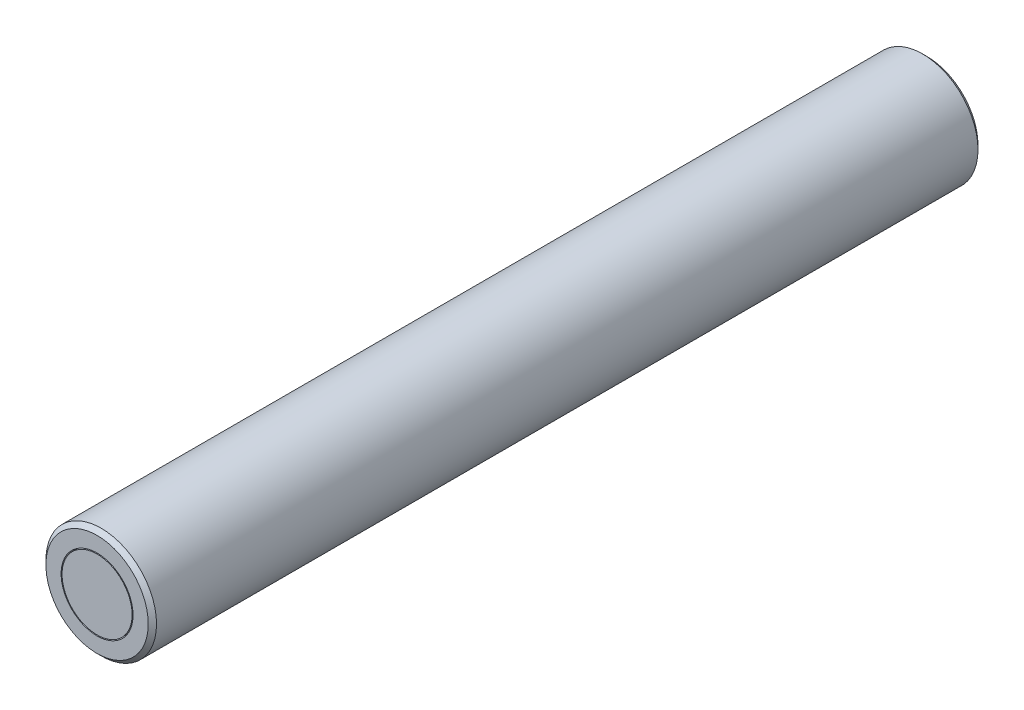
ISO-10303-21;
HEADER;
FILE_DESCRIPTION(('STEP AP214'),'2;1');
FILE_NAME('part.step','',(''),(''),'','','');
FILE_SCHEMA(('AUTOMOTIVE_DESIGN { 1 0 10303 214 1 1 1 1 }'));
ENDSEC;
DATA;
#1=APPLICATION_CONTEXT('core data for automotive mechanical design processes');
#2=APPLICATION_PROTOCOL_DEFINITION('international standard','automotive_design',2000,#1);
#3=PRODUCT_CONTEXT('',#1,'mechanical');
#4=PRODUCT('Part','Part','',(#3));
#5=PRODUCT_RELATED_PRODUCT_CATEGORY('part','',(#4));
#6=PRODUCT_DEFINITION_FORMATION('','',#4);
#7=PRODUCT_DEFINITION_CONTEXT('part definition',#1,'design');
#8=PRODUCT_DEFINITION('design','',#6,#7);
#9=PRODUCT_DEFINITION_SHAPE('','',#8);
#10=(LENGTH_UNIT() NAMED_UNIT(*) SI_UNIT(.MILLI.,.METRE.));
#11=(NAMED_UNIT(*) PLANE_ANGLE_UNIT() SI_UNIT($,.RADIAN.));
#12=(NAMED_UNIT(*) SI_UNIT($,.STERADIAN.) SOLID_ANGLE_UNIT());
#13=UNCERTAINTY_MEASURE_WITH_UNIT(LENGTH_MEASURE(1.E-05),#10,'distance_accuracy_value','');
#14=(GEOMETRIC_REPRESENTATION_CONTEXT(3) GLOBAL_UNCERTAINTY_ASSIGNED_CONTEXT((#13)) GLOBAL_UNIT_ASSIGNED_CONTEXT((#10,
#11,#12)) REPRESENTATION_CONTEXT('',''));
#15=CARTESIAN_POINT('',(0.,0.,0.));
#16=DIRECTION('',(0.,0.,1.));
#17=DIRECTION('',(1.,0.,0.));
#18=AXIS2_PLACEMENT_3D('',#15,#16,#17);
#19=CARTESIAN_POINT('',(0.,0.,0.));
#20=DIRECTION('',(0.,0.,1.));
#21=DIRECTION('',(1.,0.,0.));
#22=AXIS2_PLACEMENT_3D('',#19,#20,#21);
#23=CYLINDRICAL_SURFACE('',#22,1.26660902965932);
#24=CARTESIAN_POINT('',(0.,0.,0.));
#25=DIRECTION('',(0.,0.,1.));
#26=DIRECTION('',(1.,0.,0.));
#27=AXIS2_PLACEMENT_3D('',#24,#25,#26);
#28=CIRCLE('',#27,1.26660902965932);
#29=CARTESIAN_POINT('',(1.26660902965932,0.,0.));
#30=VERTEX_POINT('',#29);
#31=EDGE_CURVE('E11',#30,#30,#28,.T.);
#32=ORIENTED_EDGE('',*,*,#31,.T.);
#33=EDGE_LOOP('',(#32));
#34=FACE_BOUND('',#33,.T.);
#35=CARTESIAN_POINT('',(0.,0.,30.));
#36=DIRECTION('',(0.,0.,1.));
#37=DIRECTION('',(1.,0.,0.));
#38=AXIS2_PLACEMENT_3D('',#35,#36,#37);
#39=CIRCLE('',#38,1.26660902965932);
#40=CARTESIAN_POINT('',(1.26660902965932,0.,30.));
#41=VERTEX_POINT('',#40);
#42=EDGE_CURVE('E59',#41,#41,#39,.T.);
#43=ORIENTED_EDGE('',*,*,#42,.F.);
#44=EDGE_LOOP('',(#43));
#45=FACE_BOUND('',#44,.T.);
#46=ADVANCED_FACE('F54',(#34,#45),#23,.T.);
#47=CARTESIAN_POINT('',(0.,0.,0.));
#48=DIRECTION('',(0.,0.,1.));
#49=DIRECTION('',(1.,0.,0.));
#50=AXIS2_PLACEMENT_3D('',#47,#48,#49);
#51=PLANE('',#50);
#52=ORIENTED_EDGE('',*,*,#31,.F.);
#53=EDGE_LOOP('',(#52));
#54=FACE_BOUND('',#53,.T.);
#55=ADVANCED_FACE('F67',(#54),#51,.F.);
#56=CARTESIAN_POINT('',(0.,0.,30.));
#57=DIRECTION('',(0.,0.,1.));
#58=DIRECTION('',(1.,0.,0.));
#59=AXIS2_PLACEMENT_3D('',#56,#57,#58);
#60=PLANE('',#59);
#61=ORIENTED_EDGE('',*,*,#42,.T.);
#62=EDGE_LOOP('',(#61));
#63=FACE_BOUND('',#62,.T.);
#64=ADVANCED_FACE('F70',(#63),#60,.T.);
#65=CLOSED_SHELL('',(#46,#55,#64));
#66=MANIFOLD_SOLID_BREP('B2',#65);
#67=CARTESIAN_POINT('',(0.,0.,30.));
#68=DIRECTION('',(0.,0.,-1.));
#69=DIRECTION('',(-1.,0.,0.));
#70=AXIS2_PLACEMENT_3D('',#67,#68,#69);
#71=CYLINDRICAL_SURFACE('',#70,2.);
#72=CARTESIAN_POINT('',(0.,0.,29.85));
#73=DIRECTION('',(0.,0.,1.));
#74=DIRECTION('',(1.,0.,0.));
#75=AXIS2_PLACEMENT_3D('',#72,#73,#74);
#76=CIRCLE('',#75,2.);
#77=CARTESIAN_POINT('',(2.,0.,29.85));
#78=VERTEX_POINT('',#77);
#79=EDGE_CURVE('E53',#78,#78,#76,.F.);
#80=ORIENTED_EDGE('',*,*,#79,.T.);
#81=EDGE_LOOP('',(#80));
#82=FACE_BOUND('',#81,.T.);
#83=CARTESIAN_POINT('',(0.,0.,0.150000000000004));
#84=DIRECTION('',(0.,0.,1.));
#85=DIRECTION('',(1.,0.,0.));
#86=AXIS2_PLACEMENT_3D('',#83,#84,#85);
#87=CIRCLE('',#86,2.);
#88=CARTESIAN_POINT('',(2.,0.,0.150000000000004));
#89=VERTEX_POINT('',#88);
#90=EDGE_CURVE('E121',#89,#89,#87,.T.);
#91=ORIENTED_EDGE('',*,*,#90,.T.);
#92=EDGE_LOOP('',(#91));
#93=FACE_BOUND('',#92,.T.);
#94=ADVANCED_FACE('F108',(#82,#93),#71,.T.);
#95=CARTESIAN_POINT('',(0.,0.,30.));
#96=DIRECTION('',(0.,0.,1.));
#97=DIRECTION('',(1.,0.,0.));
#98=AXIS2_PLACEMENT_3D('',#95,#96,#97);
#99=PLANE('',#98);
#100=CARTESIAN_POINT('',(0.,0.,30.));
#101=DIRECTION('',(0.,0.,1.));
#102=DIRECTION('',(1.,0.,0.));
#103=AXIS2_PLACEMENT_3D('',#100,#101,#102);
#104=CIRCLE('',#103,1.85);
#105=CARTESIAN_POINT('',(1.85,0.,30.));
#106=VERTEX_POINT('',#105);
#107=EDGE_CURVE('E116',#106,#106,#104,.T.);
#108=ORIENTED_EDGE('',*,*,#107,.T.);
#109=EDGE_LOOP('',(#108));
#110=FACE_BOUND('',#109,.T.);
#111=CARTESIAN_POINT('',(0.,0.,30.));
#112=DIRECTION('',(0.,0.,1.));
#113=DIRECTION('',(1.,0.,0.));
#114=AXIS2_PLACEMENT_3D('',#111,#112,#113);
#115=CIRCLE('',#114,1.3);
#116=CARTESIAN_POINT('',(1.3,0.,30.));
#117=VERTEX_POINT('',#116);
#118=EDGE_CURVE('E129',#117,#117,#115,.T.);
#119=ORIENTED_EDGE('',*,*,#118,.F.);
#120=EDGE_LOOP('',(#119));
#121=FACE_BOUND('',#120,.T.);
#122=ADVANCED_FACE('F139',(#110,#121),#99,.T.);
#123=CARTESIAN_POINT('',(0.,0.,0.));
#124=DIRECTION('',(0.,0.,1.));
#125=DIRECTION('',(1.,0.,0.));
#126=AXIS2_PLACEMENT_3D('',#123,#124,#125);
#127=PLANE('',#126);
#128=CARTESIAN_POINT('',(0.,0.,0.));
#129=DIRECTION('',(0.,0.,1.));
#130=DIRECTION('',(1.,0.,0.));
#131=AXIS2_PLACEMENT_3D('',#128,#129,#130);
#132=CIRCLE('',#131,1.85);
#133=CARTESIAN_POINT('',(1.85,0.,0.));
#134=VERTEX_POINT('',#133);
#135=EDGE_CURVE('E119',#134,#134,#132,.F.);
#136=ORIENTED_EDGE('',*,*,#135,.T.);
#137=EDGE_LOOP('',(#136));
#138=FACE_BOUND('',#137,.T.);
#139=CARTESIAN_POINT('',(0.,0.,0.));
#140=DIRECTION('',(0.,0.,1.));
#141=DIRECTION('',(1.,0.,0.));
#142=AXIS2_PLACEMENT_3D('',#139,#140,#141);
#143=CIRCLE('',#142,1.3);
#144=CARTESIAN_POINT('',(1.3,0.,0.));
#145=VERTEX_POINT('',#144);
#146=EDGE_CURVE('E127',#145,#145,#143,.T.);
#147=ORIENTED_EDGE('',*,*,#146,.T.);
#148=EDGE_LOOP('',(#147));
#149=FACE_BOUND('',#148,.T.);
#150=ADVANCED_FACE('F142',(#138,#149),#127,.F.);
#151=CARTESIAN_POINT('',(0.,0.,30.));
#152=DIRECTION('',(0.,0.,-1.));
#153=DIRECTION('',(-1.,0.,0.));
#154=AXIS2_PLACEMENT_3D('',#151,#152,#153);
#155=CYLINDRICAL_SURFACE('',#154,1.3);
#156=ORIENTED_EDGE('',*,*,#118,.T.);
#157=EDGE_LOOP('',(#156));
#158=FACE_BOUND('',#157,.T.);
#159=ORIENTED_EDGE('',*,*,#146,.F.);
#160=EDGE_LOOP('',(#159));
#161=FACE_BOUND('',#160,.T.);
#162=ADVANCED_FACE('F138',(#158,#161),#155,.F.);
#163=CARTESIAN_POINT('',(0.,0.,0.150000000000004));
#164=DIRECTION('',(0.,0.,1.));
#165=DIRECTION('',(1.,0.,0.));
#166=AXIS2_PLACEMENT_3D('',#163,#164,#165);
#167=CONICAL_SURFACE('',#166,2.,0.785398163397443);
#168=ORIENTED_EDGE('',*,*,#135,.F.);
#169=EDGE_LOOP('',(#168));
#170=FACE_BOUND('',#169,.T.);
#171=ORIENTED_EDGE('',*,*,#90,.F.);
#172=EDGE_LOOP('',(#171));
#173=FACE_BOUND('',#172,.T.);
#174=ADVANCED_FACE('F151',(#170,#173),#167,.T.);
#175=CARTESIAN_POINT('',(0.,0.,30.));
#176=DIRECTION('',(0.,0.,-1.));
#177=DIRECTION('',(-1.,0.,0.));
#178=AXIS2_PLACEMENT_3D('',#175,#176,#177);
#179=CONICAL_SURFACE('',#178,1.85,0.785398163397443);
#180=ORIENTED_EDGE('',*,*,#79,.F.);
#181=EDGE_LOOP('',(#180));
#182=FACE_BOUND('',#181,.T.);
#183=ORIENTED_EDGE('',*,*,#107,.F.);
#184=EDGE_LOOP('',(#183));
#185=FACE_BOUND('',#184,.T.);
#186=ADVANCED_FACE('F111',(#182,#185),#179,.T.);
#187=CLOSED_SHELL('',(#94,#122,#150,#162,#174,#186));
#188=MANIFOLD_SOLID_BREP('B6',#187);
#189=ADVANCED_BREP_SHAPE_REPRESENTATION('',(#18,#66,#188),#14);
#190=SHAPE_DEFINITION_REPRESENTATION(#9,#189);
ENDSEC;
END-ISO-10303-21;
